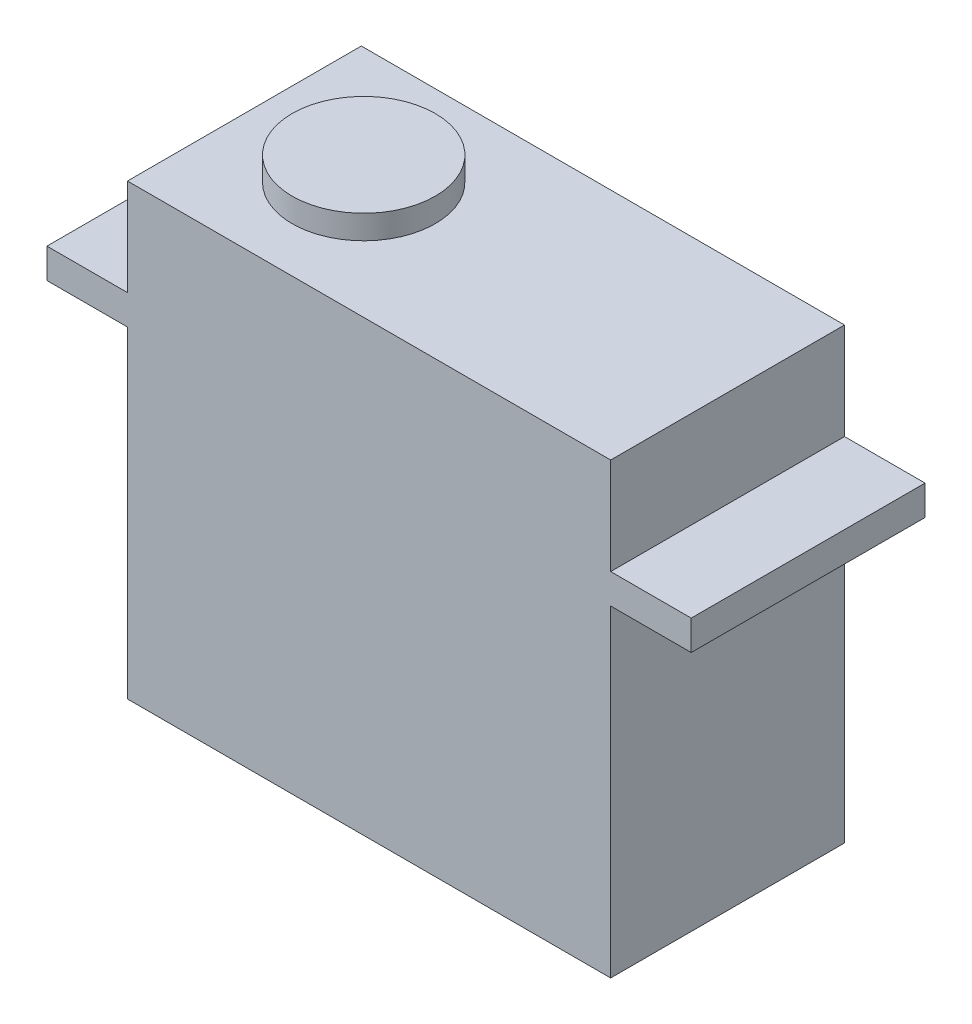
ISO-10303-21;
HEADER;
FILE_DESCRIPTION(('STEP AP214'),'2;1');
FILE_NAME('part.step','',(''),(''),'','','');
FILE_SCHEMA(('AUTOMOTIVE_DESIGN { 1 0 10303 214 1 1 1 1 }'));
ENDSEC;
DATA;
#1=APPLICATION_CONTEXT('core data for automotive mechanical design processes');
#2=APPLICATION_PROTOCOL_DEFINITION('international standard','automotive_design',2000,#1);
#3=PRODUCT_CONTEXT('',#1,'mechanical');
#4=PRODUCT('Part','Part','',(#3));
#5=PRODUCT_RELATED_PRODUCT_CATEGORY('part','',(#4));
#6=PRODUCT_DEFINITION_FORMATION('','',#4);
#7=PRODUCT_DEFINITION_CONTEXT('part definition',#1,'design');
#8=PRODUCT_DEFINITION('design','',#6,#7);
#9=PRODUCT_DEFINITION_SHAPE('','',#8);
#10=(LENGTH_UNIT() NAMED_UNIT(*) SI_UNIT(.MILLI.,.METRE.));
#11=(NAMED_UNIT(*) PLANE_ANGLE_UNIT() SI_UNIT($,.RADIAN.));
#12=(NAMED_UNIT(*) SI_UNIT($,.STERADIAN.) SOLID_ANGLE_UNIT());
#13=UNCERTAINTY_MEASURE_WITH_UNIT(LENGTH_MEASURE(1.E-05),#10,'distance_accuracy_value','');
#14=(GEOMETRIC_REPRESENTATION_CONTEXT(3) GLOBAL_UNCERTAINTY_ASSIGNED_CONTEXT((#13)) GLOBAL_UNIT_ASSIGNED_CONTEXT((#10,
#11,#12)) REPRESENTATION_CONTEXT('',''));
#15=CARTESIAN_POINT('',(0.,0.,0.));
#16=DIRECTION('',(0.,0.,1.));
#17=DIRECTION('',(1.,0.,0.));
#18=AXIS2_PLACEMENT_3D('',#15,#16,#17);
#19=CARTESIAN_POINT('',(20.25,37.6,9.8));
#20=DIRECTION('',(-1.,0.,0.));
#21=DIRECTION('',(0.,0.,1.));
#22=AXIS2_PLACEMENT_3D('',#19,#20,#21);
#23=PLANE('',#22);
#24=DIRECTION('',(0.,0.,1.));
#25=VECTOR('',#24,1.);
#26=CARTESIAN_POINT('',(20.25,29.5,-9.8));
#27=LINE('',#26,#25);
#28=CARTESIAN_POINT('',(20.25,29.5,-9.8));
#29=VERTEX_POINT('',#28);
#30=CARTESIAN_POINT('',(20.25,29.5,9.8));
#31=VERTEX_POINT('',#30);
#32=EDGE_CURVE('E126',#29,#31,#27,.T.);
#33=ORIENTED_EDGE('',*,*,#32,.F.);
#34=DIRECTION('',(0.,-1.,0.));
#35=VECTOR('',#34,1.);
#36=CARTESIAN_POINT('',(20.25,37.6,-9.8));
#37=LINE('',#36,#35);
#38=CARTESIAN_POINT('',(20.25,37.6,-9.8));
#39=VERTEX_POINT('',#38);
#40=EDGE_CURVE('E45',#39,#29,#37,.T.);
#41=ORIENTED_EDGE('',*,*,#40,.F.);
#42=DIRECTION('',(0.,0.,-1.));
#43=VECTOR('',#42,1.);
#44=CARTESIAN_POINT('',(20.25,37.6,9.8));
#45=LINE('',#44,#43);
#46=CARTESIAN_POINT('',(20.25,37.6,9.8));
#47=VERTEX_POINT('',#46);
#48=EDGE_CURVE('E151',#47,#39,#45,.T.);
#49=ORIENTED_EDGE('',*,*,#48,.F.);
#50=DIRECTION('',(0.,-1.,0.));
#51=VECTOR('',#50,1.);
#52=CARTESIAN_POINT('',(20.25,37.6,9.8));
#53=LINE('',#52,#51);
#54=EDGE_CURVE('E144',#47,#31,#53,.T.);
#55=ORIENTED_EDGE('',*,*,#54,.T.);
#56=EDGE_LOOP('',(#33,#41,#49,#55));
#57=FACE_BOUND('',#56,.T.);
#58=ADVANCED_FACE('F37',(#57),#23,.F.);
#59=CARTESIAN_POINT('',(-20.25,37.6,9.8));
#60=DIRECTION('',(1.,0.,0.));
#61=DIRECTION('',(0.,0.,-1.));
#62=AXIS2_PLACEMENT_3D('',#59,#60,#61);
#63=PLANE('',#62);
#64=DIRECTION('',(0.,0.,1.));
#65=VECTOR('',#64,1.);
#66=CARTESIAN_POINT('',(-20.25,27.,-9.8));
#67=LINE('',#66,#65);
#68=CARTESIAN_POINT('',(-20.25,27.,-9.8));
#69=VERTEX_POINT('',#68);
#70=CARTESIAN_POINT('',(-20.25,27.,9.8));
#71=VERTEX_POINT('',#70);
#72=EDGE_CURVE('E192',#69,#71,#67,.T.);
#73=ORIENTED_EDGE('',*,*,#72,.F.);
#74=DIRECTION('',(0.,-1.,0.));
#75=VECTOR('',#74,1.);
#76=CARTESIAN_POINT('',(-20.25,37.6,-9.8));
#77=LINE('',#76,#75);
#78=CARTESIAN_POINT('',(-20.25,0.,-9.8));
#79=VERTEX_POINT('',#78);
#80=EDGE_CURVE('E163',#69,#79,#77,.T.);
#81=ORIENTED_EDGE('',*,*,#80,.T.);
#82=DIRECTION('',(0.,0.,1.));
#83=VECTOR('',#82,1.);
#84=CARTESIAN_POINT('',(-20.25,0.,9.8));
#85=LINE('',#84,#83);
#86=CARTESIAN_POINT('',(-20.25,0.,9.8));
#87=VERTEX_POINT('',#86);
#88=EDGE_CURVE('E186',#79,#87,#85,.T.);
#89=ORIENTED_EDGE('',*,*,#88,.T.);
#90=DIRECTION('',(0.,-1.,0.));
#91=VECTOR('',#90,1.);
#92=CARTESIAN_POINT('',(-20.25,37.6,9.8));
#93=LINE('',#92,#91);
#94=EDGE_CURVE('E152',#71,#87,#93,.T.);
#95=ORIENTED_EDGE('',*,*,#94,.F.);
#96=EDGE_LOOP('',(#73,#81,#89,#95));
#97=FACE_BOUND('',#96,.T.);
#98=ADVANCED_FACE('F257',(#97),#63,.F.);
#99=CARTESIAN_POINT('',(20.25,27.,-9.8));
#100=VERTEX_POINT('',#99);
#101=CARTESIAN_POINT('',(20.25,0.,-9.8));
#102=VERTEX_POINT('',#101);
#103=EDGE_CURVE('E166',#100,#102,#37,.T.);
#104=ORIENTED_EDGE('',*,*,#103,.F.);
#105=DIRECTION('',(0.,0.,1.));
#106=VECTOR('',#105,1.);
#107=CARTESIAN_POINT('',(20.25,27.,-9.8));
#108=LINE('',#107,#106);
#109=CARTESIAN_POINT('',(20.25,27.,9.8));
#110=VERTEX_POINT('',#109);
#111=EDGE_CURVE('E238',#100,#110,#108,.T.);
#112=ORIENTED_EDGE('',*,*,#111,.T.);
#113=CARTESIAN_POINT('',(20.25,0.,9.8));
#114=VERTEX_POINT('',#113);
#115=EDGE_CURVE('E153',#110,#114,#53,.T.);
#116=ORIENTED_EDGE('',*,*,#115,.T.);
#117=DIRECTION('',(0.,0.,-1.));
#118=VECTOR('',#117,1.);
#119=CARTESIAN_POINT('',(20.25,0.,9.8));
#120=LINE('',#119,#118);
#121=EDGE_CURVE('E184',#114,#102,#120,.T.);
#122=ORIENTED_EDGE('',*,*,#121,.T.);
#123=EDGE_LOOP('',(#104,#112,#116,#122));
#124=FACE_BOUND('',#123,.T.);
#125=ADVANCED_FACE('F39',(#124),#23,.F.);
#126=CARTESIAN_POINT('',(-20.25,37.6,-9.8));
#127=DIRECTION('',(0.,0.,1.));
#128=DIRECTION('',(1.,0.,0.));
#129=AXIS2_PLACEMENT_3D('',#126,#127,#128);
#130=PLANE('',#129);
#131=DIRECTION('',(-1.,0.,0.));
#132=VECTOR('',#131,1.);
#133=CARTESIAN_POINT('',(-20.25,0.,-9.8));
#134=LINE('',#133,#132);
#135=EDGE_CURVE('E174',#102,#79,#134,.T.);
#136=ORIENTED_EDGE('',*,*,#135,.T.);
#137=ORIENTED_EDGE('',*,*,#80,.F.);
#138=DIRECTION('',(1.,0.,0.));
#139=VECTOR('',#138,1.);
#140=CARTESIAN_POINT('',(-27.,27.,-9.8));
#141=LINE('',#140,#139);
#142=CARTESIAN_POINT('',(-27.,27.,-9.8));
#143=VERTEX_POINT('',#142);
#144=EDGE_CURVE('E215',#143,#69,#141,.T.);
#145=ORIENTED_EDGE('',*,*,#144,.F.);
#146=DIRECTION('',(0.,-1.,0.));
#147=VECTOR('',#146,1.);
#148=CARTESIAN_POINT('',(-27.,29.5,-9.8));
#149=LINE('',#148,#147);
#150=CARTESIAN_POINT('',(-27.,29.5,-9.8));
#151=VERTEX_POINT('',#150);
#152=EDGE_CURVE('E218',#151,#143,#149,.T.);
#153=ORIENTED_EDGE('',*,*,#152,.F.);
#154=DIRECTION('',(-1.,0.,0.));
#155=VECTOR('',#154,1.);
#156=CARTESIAN_POINT('',(-20.25,29.5,-9.8));
#157=LINE('',#156,#155);
#158=CARTESIAN_POINT('',(-20.25,29.5,-9.8));
#159=VERTEX_POINT('',#158);
#160=EDGE_CURVE('E226',#159,#151,#157,.T.);
#161=ORIENTED_EDGE('',*,*,#160,.F.);
#162=CARTESIAN_POINT('',(-20.25,37.6,-9.8));
#163=VERTEX_POINT('',#162);
#164=EDGE_CURVE('E164',#163,#159,#77,.T.);
#165=ORIENTED_EDGE('',*,*,#164,.F.);
#166=DIRECTION('',(-1.,0.,0.));
#167=VECTOR('',#166,1.);
#168=CARTESIAN_POINT('',(-20.25,37.6,-9.8));
#169=LINE('',#168,#167);
#170=EDGE_CURVE('E198',#39,#163,#169,.T.);
#171=ORIENTED_EDGE('',*,*,#170,.F.);
#172=ORIENTED_EDGE('',*,*,#40,.T.);
#173=DIRECTION('',(-1.,0.,0.));
#174=VECTOR('',#173,1.);
#175=CARTESIAN_POINT('',(20.25,29.5,-9.8));
#176=LINE('',#175,#174);
#177=CARTESIAN_POINT('',(27.,29.5,-9.8));
#178=VERTEX_POINT('',#177);
#179=EDGE_CURVE('E131',#178,#29,#176,.T.);
#180=ORIENTED_EDGE('',*,*,#179,.F.);
#181=DIRECTION('',(0.,1.,0.));
#182=VECTOR('',#181,1.);
#183=CARTESIAN_POINT('',(27.,29.5,-9.8));
#184=LINE('',#183,#182);
#185=CARTESIAN_POINT('',(27.,27.,-9.8));
#186=VERTEX_POINT('',#185);
#187=EDGE_CURVE('E234',#186,#178,#184,.T.);
#188=ORIENTED_EDGE('',*,*,#187,.F.);
#189=DIRECTION('',(1.,0.,0.));
#190=VECTOR('',#189,1.);
#191=CARTESIAN_POINT('',(27.,27.,-9.8));
#192=LINE('',#191,#190);
#193=EDGE_CURVE('E148',#100,#186,#192,.T.);
#194=ORIENTED_EDGE('',*,*,#193,.F.);
#195=ORIENTED_EDGE('',*,*,#103,.T.);
#196=EDGE_LOOP('',(#136,#137,#145,#153,#161,#165,#171,#172,#180,#188,#194,#195));
#197=FACE_BOUND('',#196,.T.);
#198=ADVANCED_FACE('F172',(#197),#130,.F.);
#199=ORIENTED_EDGE('',*,*,#164,.T.);
#200=DIRECTION('',(0.,0.,1.));
#201=VECTOR('',#200,1.);
#202=CARTESIAN_POINT('',(-20.25,29.5,-9.8));
#203=LINE('',#202,#201);
#204=CARTESIAN_POINT('',(-20.25,29.5,9.8));
#205=VERTEX_POINT('',#204);
#206=EDGE_CURVE('E210',#159,#205,#203,.T.);
#207=ORIENTED_EDGE('',*,*,#206,.T.);
#208=CARTESIAN_POINT('',(-20.25,37.6,9.8));
#209=VERTEX_POINT('',#208);
#210=EDGE_CURVE('E155',#209,#205,#93,.T.);
#211=ORIENTED_EDGE('',*,*,#210,.F.);
#212=DIRECTION('',(0.,0.,1.));
#213=VECTOR('',#212,1.);
#214=CARTESIAN_POINT('',(-20.25,37.6,9.8));
#215=LINE('',#214,#213);
#216=EDGE_CURVE('E201',#163,#209,#215,.T.);
#217=ORIENTED_EDGE('',*,*,#216,.F.);
#218=EDGE_LOOP('',(#199,#207,#211,#217));
#219=FACE_BOUND('',#218,.T.);
#220=ADVANCED_FACE('F209',(#219),#63,.F.);
#221=CARTESIAN_POINT('',(-20.25,37.6,9.8));
#222=DIRECTION('',(0.,0.,-1.));
#223=DIRECTION('',(-1.,0.,0.));
#224=AXIS2_PLACEMENT_3D('',#221,#222,#223);
#225=PLANE('',#224);
#226=DIRECTION('',(1.,0.,0.));
#227=VECTOR('',#226,1.);
#228=CARTESIAN_POINT('',(-20.25,0.,9.8));
#229=LINE('',#228,#227);
#230=EDGE_CURVE('E159',#87,#114,#229,.T.);
#231=ORIENTED_EDGE('',*,*,#230,.T.);
#232=ORIENTED_EDGE('',*,*,#115,.F.);
#233=DIRECTION('',(1.,0.,0.));
#234=VECTOR('',#233,1.);
#235=CARTESIAN_POINT('',(27.,27.,9.8));
#236=LINE('',#235,#234);
#237=CARTESIAN_POINT('',(27.,27.,9.8));
#238=VERTEX_POINT('',#237);
#239=EDGE_CURVE('E52',#110,#238,#236,.T.);
#240=ORIENTED_EDGE('',*,*,#239,.T.);
#241=DIRECTION('',(0.,1.,0.));
#242=VECTOR('',#241,1.);
#243=CARTESIAN_POINT('',(27.,29.5,9.8));
#244=LINE('',#243,#242);
#245=CARTESIAN_POINT('',(27.,29.5,9.8));
#246=VERTEX_POINT('',#245);
#247=EDGE_CURVE('E147',#238,#246,#244,.T.);
#248=ORIENTED_EDGE('',*,*,#247,.T.);
#249=DIRECTION('',(-1.,0.,0.));
#250=VECTOR('',#249,1.);
#251=CARTESIAN_POINT('',(20.25,29.5,9.8));
#252=LINE('',#251,#250);
#253=EDGE_CURVE('E129',#246,#31,#252,.T.);
#254=ORIENTED_EDGE('',*,*,#253,.T.);
#255=ORIENTED_EDGE('',*,*,#54,.F.);
#256=DIRECTION('',(1.,0.,0.));
#257=VECTOR('',#256,1.);
#258=CARTESIAN_POINT('',(-20.25,37.6,9.8));
#259=LINE('',#258,#257);
#260=EDGE_CURVE('E157',#209,#47,#259,.T.);
#261=ORIENTED_EDGE('',*,*,#260,.F.);
#262=ORIENTED_EDGE('',*,*,#210,.T.);
#263=DIRECTION('',(-1.,0.,0.));
#264=VECTOR('',#263,1.);
#265=CARTESIAN_POINT('',(-20.25,29.5,9.8));
#266=LINE('',#265,#264);
#267=CARTESIAN_POINT('',(-27.,29.5,9.8));
#268=VERTEX_POINT('',#267);
#269=EDGE_CURVE('E60',#205,#268,#266,.T.);
#270=ORIENTED_EDGE('',*,*,#269,.T.);
#271=DIRECTION('',(0.,-1.,0.));
#272=VECTOR('',#271,1.);
#273=CARTESIAN_POINT('',(-27.,29.5,9.8));
#274=LINE('',#273,#272);
#275=CARTESIAN_POINT('',(-27.,27.,9.8));
#276=VERTEX_POINT('',#275);
#277=EDGE_CURVE('E227',#268,#276,#274,.T.);
#278=ORIENTED_EDGE('',*,*,#277,.T.);
#279=DIRECTION('',(1.,0.,0.));
#280=VECTOR('',#279,1.);
#281=CARTESIAN_POINT('',(-27.,27.,9.8));
#282=LINE('',#281,#280);
#283=EDGE_CURVE('E223',#276,#71,#282,.T.);
#284=ORIENTED_EDGE('',*,*,#283,.T.);
#285=ORIENTED_EDGE('',*,*,#94,.T.);
#286=EDGE_LOOP('',(#231,#232,#240,#248,#254,#255,#261,#262,#270,#278,#284,#285));
#287=FACE_BOUND('',#286,.T.);
#288=ADVANCED_FACE('F142',(#287),#225,.F.);
#289=CARTESIAN_POINT('',(0.,37.6,0.));
#290=DIRECTION('',(0.,-1.,0.));
#291=DIRECTION('',(0.,0.,-1.));
#292=AXIS2_PLACEMENT_3D('',#289,#290,#291);
#293=PLANE('',#292);
#294=CARTESIAN_POINT('',(-10.25,37.6,0.));
#295=DIRECTION('',(0.,-1.,0.));
#296=DIRECTION('',(0.,0.,-1.));
#297=AXIS2_PLACEMENT_3D('',#294,#295,#296);
#298=CIRCLE('',#297,6.);
#299=CARTESIAN_POINT('',(-10.25,37.6,-6.));
#300=VERTEX_POINT('',#299);
#301=EDGE_CURVE('E11',#300,#300,#298,.F.);
#302=ORIENTED_EDGE('',*,*,#301,.F.);
#303=EDGE_LOOP('',(#302));
#304=FACE_BOUND('',#303,.T.);
#305=ORIENTED_EDGE('',*,*,#48,.T.);
#306=ORIENTED_EDGE('',*,*,#170,.T.);
#307=ORIENTED_EDGE('',*,*,#216,.T.);
#308=ORIENTED_EDGE('',*,*,#260,.T.);
#309=EDGE_LOOP('',(#305,#306,#307,#308));
#310=FACE_BOUND('',#309,.T.);
#311=ADVANCED_FACE('F206',(#304,#310),#293,.F.);
#312=CARTESIAN_POINT('',(0.,0.,0.));
#313=DIRECTION('',(0.,-1.,0.));
#314=DIRECTION('',(0.,0.,-1.));
#315=AXIS2_PLACEMENT_3D('',#312,#313,#314);
#316=PLANE('',#315);
#317=ORIENTED_EDGE('',*,*,#121,.F.);
#318=ORIENTED_EDGE('',*,*,#230,.F.);
#319=ORIENTED_EDGE('',*,*,#88,.F.);
#320=ORIENTED_EDGE('',*,*,#135,.F.);
#321=EDGE_LOOP('',(#317,#318,#319,#320));
#322=FACE_BOUND('',#321,.T.);
#323=ADVANCED_FACE('F182',(#322),#316,.T.);
#324=CARTESIAN_POINT('',(-10.25,39.6,0.));
#325=DIRECTION('',(0.,-1.,0.));
#326=DIRECTION('',(0.,0.,-1.));
#327=AXIS2_PLACEMENT_3D('',#324,#325,#326);
#328=CYLINDRICAL_SURFACE('',#327,6.);
#329=CARTESIAN_POINT('',(-10.25,39.6,0.));
#330=DIRECTION('',(0.,1.,0.));
#331=DIRECTION('',(0.,0.,1.));
#332=AXIS2_PLACEMENT_3D('',#329,#330,#331);
#333=CIRCLE('',#332,6.);
#334=CARTESIAN_POINT('',(-10.25,39.6,6.));
#335=VERTEX_POINT('',#334);
#336=EDGE_CURVE('E189',#335,#335,#333,.T.);
#337=ORIENTED_EDGE('',*,*,#336,.F.);
#338=EDGE_LOOP('',(#337));
#339=FACE_BOUND('',#338,.T.);
#340=ORIENTED_EDGE('',*,*,#301,.T.);
#341=EDGE_LOOP('',(#340));
#342=FACE_BOUND('',#341,.T.);
#343=ADVANCED_FACE('F274',(#339,#342),#328,.T.);
#344=CARTESIAN_POINT('',(-10.25,39.6,0.));
#345=DIRECTION('',(0.,1.,0.));
#346=DIRECTION('',(0.,0.,1.));
#347=AXIS2_PLACEMENT_3D('',#344,#345,#346);
#348=PLANE('',#347);
#349=ORIENTED_EDGE('',*,*,#336,.T.);
#350=EDGE_LOOP('',(#349));
#351=FACE_BOUND('',#350,.T.);
#352=ADVANCED_FACE('F280',(#351),#348,.T.);
#353=CARTESIAN_POINT('',(-27.,27.,-9.8));
#354=DIRECTION('',(0.,-1.,0.));
#355=DIRECTION('',(0.,0.,-1.));
#356=AXIS2_PLACEMENT_3D('',#353,#354,#355);
#357=PLANE('',#356);
#358=ORIENTED_EDGE('',*,*,#283,.F.);
#359=DIRECTION('',(0.,0.,1.));
#360=VECTOR('',#359,1.);
#361=CARTESIAN_POINT('',(-27.,27.,-9.8));
#362=LINE('',#361,#360);
#363=EDGE_CURVE('E216',#143,#276,#362,.T.);
#364=ORIENTED_EDGE('',*,*,#363,.F.);
#365=ORIENTED_EDGE('',*,*,#144,.T.);
#366=ORIENTED_EDGE('',*,*,#72,.T.);
#367=EDGE_LOOP('',(#358,#364,#365,#366));
#368=FACE_BOUND('',#367,.T.);
#369=ADVANCED_FACE('F284',(#368),#357,.T.);
#370=CARTESIAN_POINT('',(-27.,29.5,-9.8));
#371=DIRECTION('',(-1.,0.,0.));
#372=DIRECTION('',(0.,0.,1.));
#373=AXIS2_PLACEMENT_3D('',#370,#371,#372);
#374=PLANE('',#373);
#375=ORIENTED_EDGE('',*,*,#277,.F.);
#376=DIRECTION('',(0.,0.,1.));
#377=VECTOR('',#376,1.);
#378=CARTESIAN_POINT('',(-27.,29.5,-9.8));
#379=LINE('',#378,#377);
#380=EDGE_CURVE('E214',#151,#268,#379,.T.);
#381=ORIENTED_EDGE('',*,*,#380,.F.);
#382=ORIENTED_EDGE('',*,*,#152,.T.);
#383=ORIENTED_EDGE('',*,*,#363,.T.);
#384=EDGE_LOOP('',(#375,#381,#382,#383));
#385=FACE_BOUND('',#384,.T.);
#386=ADVANCED_FACE('F288',(#385),#374,.T.);
#387=CARTESIAN_POINT('',(-20.25,29.5,-9.8));
#388=DIRECTION('',(0.,1.,0.));
#389=DIRECTION('',(-1.,0.,0.));
#390=AXIS2_PLACEMENT_3D('',#387,#388,#389);
#391=PLANE('',#390);
#392=ORIENTED_EDGE('',*,*,#269,.F.);
#393=ORIENTED_EDGE('',*,*,#206,.F.);
#394=ORIENTED_EDGE('',*,*,#160,.T.);
#395=ORIENTED_EDGE('',*,*,#380,.T.);
#396=EDGE_LOOP('',(#392,#393,#394,#395));
#397=FACE_BOUND('',#396,.T.);
#398=ADVANCED_FACE('F254',(#397),#391,.T.);
#399=CARTESIAN_POINT('',(20.25,29.5,-9.8));
#400=DIRECTION('',(0.,1.,0.));
#401=DIRECTION('',(0.,0.,1.));
#402=AXIS2_PLACEMENT_3D('',#399,#400,#401);
#403=PLANE('',#402);
#404=ORIENTED_EDGE('',*,*,#253,.F.);
#405=DIRECTION('',(0.,0.,1.));
#406=VECTOR('',#405,1.);
#407=CARTESIAN_POINT('',(27.,29.5,-9.8));
#408=LINE('',#407,#406);
#409=EDGE_CURVE('E136',#178,#246,#408,.T.);
#410=ORIENTED_EDGE('',*,*,#409,.F.);
#411=ORIENTED_EDGE('',*,*,#179,.T.);
#412=ORIENTED_EDGE('',*,*,#32,.T.);
#413=EDGE_LOOP('',(#404,#410,#411,#412));
#414=FACE_BOUND('',#413,.T.);
#415=ADVANCED_FACE('F128',(#414),#403,.T.);
#416=CARTESIAN_POINT('',(27.,29.5,-9.8));
#417=DIRECTION('',(1.,0.,0.));
#418=DIRECTION('',(0.,0.,-1.));
#419=AXIS2_PLACEMENT_3D('',#416,#417,#418);
#420=PLANE('',#419);
#421=ORIENTED_EDGE('',*,*,#247,.F.);
#422=DIRECTION('',(0.,0.,1.));
#423=VECTOR('',#422,1.);
#424=CARTESIAN_POINT('',(27.,27.,-9.8));
#425=LINE('',#424,#423);
#426=EDGE_CURVE('E242',#186,#238,#425,.T.);
#427=ORIENTED_EDGE('',*,*,#426,.F.);
#428=ORIENTED_EDGE('',*,*,#187,.T.);
#429=ORIENTED_EDGE('',*,*,#409,.T.);
#430=EDGE_LOOP('',(#421,#427,#428,#429));
#431=FACE_BOUND('',#430,.T.);
#432=ADVANCED_FACE('F246',(#431),#420,.T.);
#433=CARTESIAN_POINT('',(27.,27.,-9.8));
#434=DIRECTION('',(0.,-1.,0.));
#435=DIRECTION('',(0.,0.,-1.));
#436=AXIS2_PLACEMENT_3D('',#433,#434,#435);
#437=PLANE('',#436);
#438=ORIENTED_EDGE('',*,*,#239,.F.);
#439=ORIENTED_EDGE('',*,*,#111,.F.);
#440=ORIENTED_EDGE('',*,*,#193,.T.);
#441=ORIENTED_EDGE('',*,*,#426,.T.);
#442=EDGE_LOOP('',(#438,#439,#440,#441));
#443=FACE_BOUND('',#442,.T.);
#444=ADVANCED_FACE('F244',(#443),#437,.T.);
#445=CLOSED_SHELL('',(#58,#98,#125,#198,#220,#288,#311,#323,#343,#352,#369,#386,#398,#415,#432,#444));
#446=MANIFOLD_SOLID_BREP('B2',#445);
#447=ADVANCED_BREP_SHAPE_REPRESENTATION('',(#18,#446),#14);
#448=SHAPE_DEFINITION_REPRESENTATION(#9,#447);
ENDSEC;
END-ISO-10303-21;
